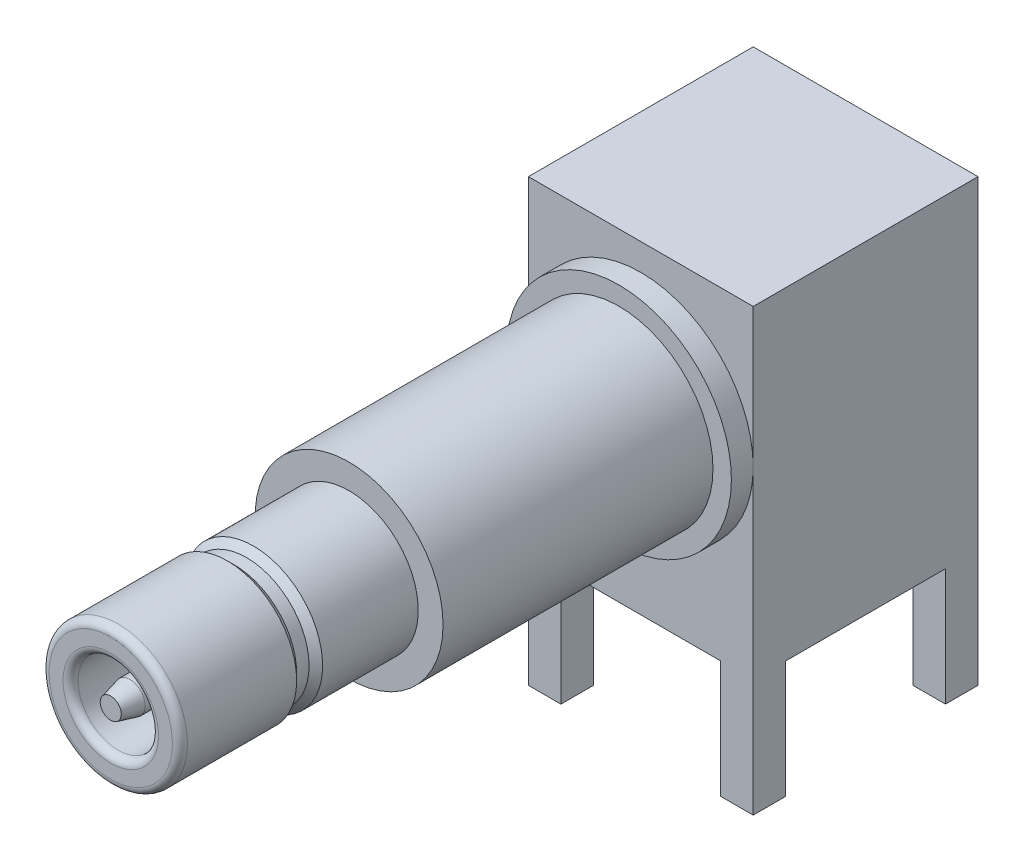
ISO-10303-21;
HEADER;
FILE_DESCRIPTION(('STEP AP214'),'2;1');
FILE_NAME('part.step','',(''),(''),'','','');
FILE_SCHEMA(('AUTOMOTIVE_DESIGN { 1 0 10303 214 1 1 1 1 }'));
ENDSEC;
DATA;
#1=APPLICATION_CONTEXT('core data for automotive mechanical design processes');
#2=APPLICATION_PROTOCOL_DEFINITION('international standard','automotive_design',2000,#1);
#3=PRODUCT_CONTEXT('',#1,'mechanical');
#4=PRODUCT('Part','Part','',(#3));
#5=PRODUCT_RELATED_PRODUCT_CATEGORY('part','',(#4));
#6=PRODUCT_DEFINITION_FORMATION('','',#4);
#7=PRODUCT_DEFINITION_CONTEXT('part definition',#1,'design');
#8=PRODUCT_DEFINITION('design','',#6,#7);
#9=PRODUCT_DEFINITION_SHAPE('','',#8);
#10=(LENGTH_UNIT() NAMED_UNIT(*) SI_UNIT(.MILLI.,.METRE.));
#11=(NAMED_UNIT(*) PLANE_ANGLE_UNIT() SI_UNIT($,.RADIAN.));
#12=(NAMED_UNIT(*) SI_UNIT($,.STERADIAN.) SOLID_ANGLE_UNIT());
#13=UNCERTAINTY_MEASURE_WITH_UNIT(LENGTH_MEASURE(1.E-05),#10,'distance_accuracy_value','');
#14=(GEOMETRIC_REPRESENTATION_CONTEXT(3) GLOBAL_UNCERTAINTY_ASSIGNED_CONTEXT((#13)) GLOBAL_UNIT_ASSIGNED_CONTEXT((#10,
#11,#12)) REPRESENTATION_CONTEXT('',''));
#15=CARTESIAN_POINT('',(0.,0.,0.));
#16=DIRECTION('',(0.,0.,1.));
#17=DIRECTION('',(1.,0.,0.));
#18=AXIS2_PLACEMENT_3D('',#15,#16,#17);
#19=CARTESIAN_POINT('',(0.,4.9,11.4319071733542));
#20=DIRECTION('',(0.,0.,1.));
#21=DIRECTION('',(1.,0.,0.));
#22=AXIS2_PLACEMENT_3D('',#19,#20,#21);
#23=PLANE('',#22);
#24=CARTESIAN_POINT('',(0.,4.9,11.4319071733542));
#25=DIRECTION('',(0.,0.,1.));
#26=DIRECTION('',(1.,0.,0.));
#27=AXIS2_PLACEMENT_3D('',#24,#25,#26);
#28=CIRCLE('',#27,1.07);
#29=CARTESIAN_POINT('',(1.07,4.9,11.4319071733542));
#30=VERTEX_POINT('',#29);
#31=EDGE_CURVE('E825',#30,#30,#28,.T.);
#32=ORIENTED_EDGE('',*,*,#31,.T.);
#33=EDGE_LOOP('',(#32));
#34=FACE_BOUND('',#33,.T.);
#35=CARTESIAN_POINT('',(0.,4.9,11.4319071733542));
#36=DIRECTION('',(0.,0.,1.));
#37=DIRECTION('',(1.,0.,0.));
#38=AXIS2_PLACEMENT_3D('',#35,#36,#37);
#39=CIRCLE('',#38,0.406972166883419);
#40=CARTESIAN_POINT('',(0.406972166883419,4.9,11.4319071733542));
#41=VERTEX_POINT('',#40);
#42=EDGE_CURVE('E839',#41,#41,#39,.T.);
#43=ORIENTED_EDGE('',*,*,#42,.F.);
#44=EDGE_LOOP('',(#43));
#45=FACE_BOUND('',#44,.T.);
#46=ADVANCED_FACE('F35',(#34,#45),#23,.T.);
#47=CARTESIAN_POINT('',(0.,4.9,17.09));
#48=DIRECTION('',(0.,0.,-1.));
#49=DIRECTION('',(-1.,0.,0.));
#50=AXIS2_PLACEMENT_3D('',#47,#48,#49);
#51=CYLINDRICAL_SURFACE('',#50,1.84);
#52=CARTESIAN_POINT('',(0.,4.9,13.295));
#53=DIRECTION('',(0.,0.,-1.));
#54=DIRECTION('',(-1.,0.,0.));
#55=AXIS2_PLACEMENT_3D('',#52,#53,#54);
#56=CIRCLE('',#55,1.84);
#57=CARTESIAN_POINT('',(-1.84,4.9,13.295));
#58=VERTEX_POINT('',#57);
#59=EDGE_CURVE('E808',#58,#58,#56,.T.);
#60=CARTESIAN_POINT('',(0.,4.9,10.75));
#61=DIRECTION('',(0.,0.,1.));
#62=DIRECTION('',(1.,0.,0.));
#63=AXIS2_PLACEMENT_3D('',#60,#61,#62);
#64=CIRCLE('',#63,1.84);
#65=CARTESIAN_POINT('',(-1.84,4.9,10.75));
#66=VERTEX_POINT('',#65);
#67=EDGE_CURVE('E810',#66,#66,#64,.T.);
#68=CARTESIAN_POINT('',(-1.84,4.9,13.295));
#69=CARTESIAN_POINT('',(-1.84,4.9,13.2684895833333));
#70=CARTESIAN_POINT('',(-1.84,4.9,13.2419791666667));
#71=CARTESIAN_POINT('',(-1.84,4.9,13.1889583333333));
#72=CARTESIAN_POINT('',(-1.84,4.9,13.1624479166667));
#73=CARTESIAN_POINT('',(-1.84,4.9,13.1094270833333));
#74=CARTESIAN_POINT('',(-1.84,4.9,13.0829166666667));
#75=CARTESIAN_POINT('',(-1.84,4.9,13.0298958333333));
#76=CARTESIAN_POINT('',(-1.84,4.9,13.0033854166667));
#77=CARTESIAN_POINT('',(-1.84,4.9,12.9503645833333));
#78=CARTESIAN_POINT('',(-1.84,4.9,12.9238541666667));
#79=CARTESIAN_POINT('',(-1.84,4.9,12.8708333333333));
#80=CARTESIAN_POINT('',(-1.84,4.9,12.8443229166667));
#81=CARTESIAN_POINT('',(-1.84,4.9,12.7913020833333));
#82=CARTESIAN_POINT('',(-1.84,4.9,12.7647916666667));
#83=CARTESIAN_POINT('',(-1.84,4.9,12.7117708333333));
#84=CARTESIAN_POINT('',(-1.84,4.9,12.6852604166667));
#85=CARTESIAN_POINT('',(-1.84,4.9,12.6322395833333));
#86=CARTESIAN_POINT('',(-1.84,4.9,12.6057291666667));
#87=CARTESIAN_POINT('',(-1.84,4.9,12.5527083333333));
#88=CARTESIAN_POINT('',(-1.84,4.9,12.5261979166667));
#89=CARTESIAN_POINT('',(-1.84,4.9,12.4731770833333));
#90=CARTESIAN_POINT('',(-1.84,4.9,12.4466666666667));
#91=CARTESIAN_POINT('',(-1.84,4.9,12.3936458333333));
#92=CARTESIAN_POINT('',(-1.84,4.9,12.3671354166667));
#93=CARTESIAN_POINT('',(-1.84,4.9,12.3141145833333));
#94=CARTESIAN_POINT('',(-1.84,4.9,12.2876041666667));
#95=CARTESIAN_POINT('',(-1.84,4.9,12.2345833333333));
#96=CARTESIAN_POINT('',(-1.84,4.9,12.2080729166667));
#97=CARTESIAN_POINT('',(-1.84,4.9,12.1550520833333));
#98=CARTESIAN_POINT('',(-1.84,4.9,12.1285416666667));
#99=CARTESIAN_POINT('',(-1.84,4.9,12.0755208333333));
#100=CARTESIAN_POINT('',(-1.84,4.9,12.0490104166667));
#101=CARTESIAN_POINT('',(-1.84,4.9,11.9959895833333));
#102=CARTESIAN_POINT('',(-1.84,4.9,11.9694791666667));
#103=CARTESIAN_POINT('',(-1.84,4.9,11.9164583333333));
#104=CARTESIAN_POINT('',(-1.84,4.9,11.8899479166667));
#105=CARTESIAN_POINT('',(-1.84,4.9,11.8369270833333));
#106=CARTESIAN_POINT('',(-1.84,4.9,11.8104166666667));
#107=CARTESIAN_POINT('',(-1.84,4.9,11.7573958333333));
#108=CARTESIAN_POINT('',(-1.84,4.9,11.7308854166667));
#109=CARTESIAN_POINT('',(-1.84,4.9,11.6778645833333));
#110=CARTESIAN_POINT('',(-1.84,4.9,11.6513541666667));
#111=CARTESIAN_POINT('',(-1.84,4.9,11.5983333333333));
#112=CARTESIAN_POINT('',(-1.84,4.9,11.5718229166667));
#113=CARTESIAN_POINT('',(-1.84,4.9,11.5188020833333));
#114=CARTESIAN_POINT('',(-1.84,4.9,11.4922916666667));
#115=CARTESIAN_POINT('',(-1.84,4.9,11.4392708333333));
#116=CARTESIAN_POINT('',(-1.84,4.9,11.4127604166667));
#117=CARTESIAN_POINT('',(-1.84,4.9,11.3597395833333));
#118=CARTESIAN_POINT('',(-1.84,4.9,11.3332291666667));
#119=CARTESIAN_POINT('',(-1.84,4.9,11.2802083333333));
#120=CARTESIAN_POINT('',(-1.84,4.9,11.2536979166667));
#121=CARTESIAN_POINT('',(-1.84,4.9,11.2006770833333));
#122=CARTESIAN_POINT('',(-1.84,4.9,11.1741666666667));
#123=CARTESIAN_POINT('',(-1.84,4.9,11.1211458333333));
#124=CARTESIAN_POINT('',(-1.84,4.9,11.0946354166667));
#125=CARTESIAN_POINT('',(-1.84,4.9,11.0416145833333));
#126=CARTESIAN_POINT('',(-1.84,4.9,11.0151041666667));
#127=CARTESIAN_POINT('',(-1.84,4.9,10.9620833333333));
#128=CARTESIAN_POINT('',(-1.84,4.9,10.9355729166667));
#129=CARTESIAN_POINT('',(-1.84,4.9,10.8825520833333));
#130=CARTESIAN_POINT('',(-1.84,4.9,10.8560416666667));
#131=CARTESIAN_POINT('',(-1.84,4.9,10.8030208333333));
#132=CARTESIAN_POINT('',(-1.84,4.9,10.7765104166667));
#133=CARTESIAN_POINT('',(-1.84,4.9,10.75));
#134=B_SPLINE_CURVE_WITH_KNOTS('',3,(#68,#69,#70,#71,#72,#73,#74,#75,#76,#77,#78,#79,#80,#81,
#82,#83,#84,#85,#86,#87,#88,#89,#90,#91,#92,#93,#94,#95,#96,#97,#98,#99,#100,#101,#102,#103,
#104,#105,#106,#107,#108,#109,#110,#111,#112,#113,#114,#115,#116,#117,#118,#119,#120,#121,#122,
#123,#124,#125,#126,#127,#128,#129,#130,#131,#132,#133),.UNSPECIFIED.,.F.,.F.,(4,2,2,2,2,2,2,2,
2,2,2,2,2,2,2,2,2,2,2,2,2,2,2,2,2,2,2,2,2,2,2,2,4),(0.,0.0795312500000006,0.159062499999999,
0.23859375,0.318125000000001,0.39765625,0.477187499999998,0.556718749999999,0.63625,0.71578125,
0.795312499999999,0.874843749999998,0.954374999999999,1.03390625,1.1134375,1.19296875,1.2725,
1.35203125,1.4315625,1.51109375,1.590625,1.67015625,1.7496875,1.82921875,1.90875,1.98828125,
2.0678125,2.14734375,2.226875,2.30640625,2.3859375,2.46546875,2.545),.UNSPECIFIED.);
#135=EDGE_CURVE('BSEAM384',#58,#66,#134,.T.);
#136=ORIENTED_EDGE('',*,*,#59,.T.);
#137=ORIENTED_EDGE('',*,*,#67,.T.);
#138=ORIENTED_EDGE('',*,*,#135,.T.);
#139=ORIENTED_EDGE('',*,*,#135,.F.);
#140=EDGE_LOOP('',(#136,#138,#137,#139));
#141=FACE_BOUND('',#140,.T.);
#142=ADVANCED_FACE('F384',(#141),#51,.T.);
#143=CARTESIAN_POINT('',(0.,4.9,10.75));
#144=DIRECTION('',(0.,0.,1.));
#145=DIRECTION('',(1.,0.,0.));
#146=AXIS2_PLACEMENT_3D('',#143,#144,#145);
#147=PLANE('',#146);
#148=CARTESIAN_POINT('',(0.,4.9,10.75));
#149=DIRECTION('',(0.,0.,1.));
#150=DIRECTION('',(1.,0.,0.));
#151=AXIS2_PLACEMENT_3D('',#148,#149,#150);
#152=CIRCLE('',#151,2.5);
#153=CARTESIAN_POINT('',(2.5,4.9,10.75));
#154=VERTEX_POINT('',#153);
#155=EDGE_CURVE('E181',#154,#154,#152,.T.);
#156=ORIENTED_EDGE('',*,*,#155,.T.);
#157=EDGE_LOOP('',(#156));
#158=FACE_BOUND('',#157,.T.);
#159=ORIENTED_EDGE('',*,*,#67,.F.);
#160=EDGE_LOOP('',(#159));
#161=FACE_BOUND('',#160,.T.);
#162=ADVANCED_FACE('F390',(#158,#161),#147,.T.);
#163=CARTESIAN_POINT('',(0.,4.9,3.57));
#164=DIRECTION('',(0.,0.,1.));
#165=DIRECTION('',(1.,0.,0.));
#166=AXIS2_PLACEMENT_3D('',#163,#164,#165);
#167=PLANE('',#166);
#168=CARTESIAN_POINT('',(0.,4.9,3.57));
#169=DIRECTION('',(0.,0.,1.));
#170=DIRECTION('',(1.,0.,0.));
#171=AXIS2_PLACEMENT_3D('',#168,#169,#170);
#172=CIRCLE('',#171,2.99);
#173=CARTESIAN_POINT('',(2.99,4.9,3.57));
#174=VERTEX_POINT('',#173);
#175=EDGE_CURVE('E180',#174,#174,#172,.T.);
#176=ORIENTED_EDGE('',*,*,#175,.T.);
#177=EDGE_LOOP('',(#176));
#178=FACE_BOUND('',#177,.T.);
#179=CARTESIAN_POINT('',(0.,4.9,3.57));
#180=DIRECTION('',(0.,0.,1.));
#181=DIRECTION('',(1.,0.,0.));
#182=AXIS2_PLACEMENT_3D('',#179,#180,#181);
#183=CIRCLE('',#182,2.5);
#184=CARTESIAN_POINT('',(2.5,4.9,3.57));
#185=VERTEX_POINT('',#184);
#186=EDGE_CURVE('E813',#185,#185,#183,.T.);
#187=ORIENTED_EDGE('',*,*,#186,.F.);
#188=EDGE_LOOP('',(#187));
#189=FACE_BOUND('',#188,.T.);
#190=ADVANCED_FACE('F425',(#178,#189),#167,.T.);
#191=CARTESIAN_POINT('',(-2.99,8.6,2.99));
#192=DIRECTION('',(0.,0.,-1.));
#193=DIRECTION('',(-1.,0.,0.));
#194=AXIS2_PLACEMENT_3D('',#191,#192,#193);
#195=PLANE('',#194);
#196=CARTESIAN_POINT('',(0.,4.9,2.99));
#197=DIRECTION('',(0.,0.,1.));
#198=DIRECTION('',(1.,0.,0.));
#199=AXIS2_PLACEMENT_3D('',#196,#197,#198);
#200=CIRCLE('',#199,2.99);
#201=CARTESIAN_POINT('',(2.99,4.9,2.99));
#202=VERTEX_POINT('',#201);
#203=CARTESIAN_POINT('',(-2.99,4.9,2.99));
#204=VERTEX_POINT('',#203);
#205=EDGE_CURVE('E175',#202,#204,#200,.T.);
#206=ORIENTED_EDGE('',*,*,#205,.F.);
#207=DIRECTION('',(0.,-1.,0.));
#208=VECTOR('',#207,1.);
#209=CARTESIAN_POINT('',(2.99,8.6,2.99));
#210=LINE('',#209,#208);
#211=CARTESIAN_POINT('',(2.99,8.6,2.99));
#212=VERTEX_POINT('',#211);
#213=EDGE_CURVE('E157',#212,#202,#210,.T.);
#214=ORIENTED_EDGE('',*,*,#213,.F.);
#215=DIRECTION('',(1.,0.,0.));
#216=VECTOR('',#215,1.);
#217=CARTESIAN_POINT('',(-2.99,8.6,2.99));
#218=LINE('',#217,#216);
#219=CARTESIAN_POINT('',(-2.99,8.6,2.99));
#220=VERTEX_POINT('',#219);
#221=EDGE_CURVE('E354',#220,#212,#218,.T.);
#222=ORIENTED_EDGE('',*,*,#221,.F.);
#223=DIRECTION('',(0.,-1.,0.));
#224=VECTOR('',#223,1.);
#225=CARTESIAN_POINT('',(-2.99,8.6,2.99));
#226=LINE('',#225,#224);
#227=EDGE_CURVE('E178',#220,#204,#226,.T.);
#228=ORIENTED_EDGE('',*,*,#227,.T.);
#229=EDGE_LOOP('',(#206,#214,#222,#228));
#230=FACE_BOUND('',#229,.T.);
#231=ADVANCED_FACE('F176',(#230),#195,.F.);
#232=EDGE_CURVE('E50',#204,#202,#200,.T.);
#233=ORIENTED_EDGE('',*,*,#232,.F.);
#234=CARTESIAN_POINT('',(-2.99,-3.12,2.99));
#235=VERTEX_POINT('',#234);
#236=EDGE_CURVE('E166',#204,#235,#226,.T.);
#237=ORIENTED_EDGE('',*,*,#236,.T.);
#238=DIRECTION('',(-1.,0.,0.));
#239=VECTOR('',#238,1.);
#240=CARTESIAN_POINT('',(-2.99,-3.12,2.99));
#241=LINE('',#240,#239);
#242=CARTESIAN_POINT('',(-2.125,-3.12,2.99));
#243=VERTEX_POINT('',#242);
#244=EDGE_CURVE('E266',#243,#235,#241,.T.);
#245=ORIENTED_EDGE('',*,*,#244,.F.);
#246=DIRECTION('',(0.,1.,0.));
#247=VECTOR('',#246,1.);
#248=CARTESIAN_POINT('',(-2.125,-3.12,2.99));
#249=LINE('',#248,#247);
#250=CARTESIAN_POINT('',(-2.125,0.,2.99));
#251=VERTEX_POINT('',#250);
#252=EDGE_CURVE('E276',#243,#251,#249,.T.);
#253=ORIENTED_EDGE('',*,*,#252,.T.);
#254=DIRECTION('',(1.,0.,0.));
#255=VECTOR('',#254,1.);
#256=CARTESIAN_POINT('',(-2.99,0.,2.99));
#257=LINE('',#256,#255);
#258=CARTESIAN_POINT('',(2.125,0.,2.99));
#259=VERTEX_POINT('',#258);
#260=EDGE_CURVE('E294',#251,#259,#257,.T.);
#261=ORIENTED_EDGE('',*,*,#260,.T.);
#262=DIRECTION('',(0.,1.,0.));
#263=VECTOR('',#262,1.);
#264=CARTESIAN_POINT('',(2.125,-3.12,2.99));
#265=LINE('',#264,#263);
#266=CARTESIAN_POINT('',(2.125,-3.12,2.99));
#267=VERTEX_POINT('',#266);
#268=EDGE_CURVE('E263',#267,#259,#265,.T.);
#269=ORIENTED_EDGE('',*,*,#268,.F.);
#270=DIRECTION('',(-1.,0.,0.));
#271=VECTOR('',#270,1.);
#272=CARTESIAN_POINT('',(2.99,-3.12,2.99));
#273=LINE('',#272,#271);
#274=CARTESIAN_POINT('',(2.99,-3.12,2.99));
#275=VERTEX_POINT('',#274);
#276=EDGE_CURVE('E170',#275,#267,#273,.T.);
#277=ORIENTED_EDGE('',*,*,#276,.F.);
#278=EDGE_CURVE('E160',#202,#275,#210,.T.);
#279=ORIENTED_EDGE('',*,*,#278,.F.);
#280=EDGE_LOOP('',(#233,#237,#245,#253,#261,#269,#277,#279));
#281=FACE_BOUND('',#280,.T.);
#282=ADVANCED_FACE('F168',(#281),#195,.F.);
#283=CARTESIAN_POINT('',(0.,0.254,0.));
#284=DIRECTION('',(0.,-1.,0.));
#285=DIRECTION('',(0.,0.,-1.));
#286=AXIS2_PLACEMENT_3D('',#283,#284,#285);
#287=PLANE('',#286);
#288=CARTESIAN_POINT('',(0.,0.254,0.));
#289=DIRECTION('',(0.,-1.,0.));
#290=DIRECTION('',(0.,0.,-1.));
#291=AXIS2_PLACEMENT_3D('',#288,#289,#290);
#292=CIRCLE('',#291,1.69360564063822);
#293=CARTESIAN_POINT('',(0.,0.254,-1.69360564063822));
#294=VERTEX_POINT('',#293);
#295=EDGE_CURVE('E199',#294,#294,#292,.T.);
#296=ORIENTED_EDGE('',*,*,#295,.T.);
#297=EDGE_LOOP('',(#296));
#298=FACE_BOUND('',#297,.T.);
#299=CARTESIAN_POINT('',(0.,0.254,0.));
#300=DIRECTION('',(0.,-1.,0.));
#301=DIRECTION('',(0.,0.,-1.));
#302=AXIS2_PLACEMENT_3D('',#299,#300,#301);
#303=CIRCLE('',#302,0.482600000000001);
#304=CARTESIAN_POINT('',(0.,0.254,-0.482600000000001));
#305=VERTEX_POINT('',#304);
#306=EDGE_CURVE('E192',#305,#305,#303,.T.);
#307=ORIENTED_EDGE('',*,*,#306,.F.);
#308=EDGE_LOOP('',(#307));
#309=FACE_BOUND('',#308,.T.);
#310=ADVANCED_FACE('F445',(#298,#309),#287,.T.);
#311=CARTESIAN_POINT('',(-2.99,0.,-2.99));
#312=DIRECTION('',(0.,-1.,0.));
#313=DIRECTION('',(0.,0.,-1.));
#314=AXIS2_PLACEMENT_3D('',#311,#312,#313);
#315=PLANE('',#314);
#316=CARTESIAN_POINT('',(0.,0.,0.));
#317=DIRECTION('',(0.,-1.,0.));
#318=DIRECTION('',(0.,0.,-1.));
#319=AXIS2_PLACEMENT_3D('',#316,#317,#318);
#320=CIRCLE('',#319,1.69360564063822);
#321=CARTESIAN_POINT('',(0.,0.,-1.69360564063822));
#322=VERTEX_POINT('',#321);
#323=EDGE_CURVE('E198',#322,#322,#320,.T.);
#324=ORIENTED_EDGE('',*,*,#323,.F.);
#325=EDGE_LOOP('',(#324));
#326=FACE_BOUND('',#325,.T.);
#327=DIRECTION('',(-1.,0.,0.));
#328=VECTOR('',#327,1.);
#329=CARTESIAN_POINT('',(-2.99,0.,-2.125));
#330=LINE('',#329,#328);
#331=CARTESIAN_POINT('',(-2.125,0.,-2.125));
#332=VERTEX_POINT('',#331);
#333=CARTESIAN_POINT('',(-2.99,0.,-2.125));
#334=VERTEX_POINT('',#333);
#335=EDGE_CURVE('E209',#332,#334,#330,.T.);
#336=ORIENTED_EDGE('',*,*,#335,.F.);
#337=DIRECTION('',(0.,0.,1.));
#338=VECTOR('',#337,1.);
#339=CARTESIAN_POINT('',(-2.125,0.,-2.99));
#340=LINE('',#339,#338);
#341=CARTESIAN_POINT('',(-2.125,0.,-2.99));
#342=VERTEX_POINT('',#341);
#343=EDGE_CURVE('E202',#342,#332,#340,.T.);
#344=ORIENTED_EDGE('',*,*,#343,.F.);
#345=DIRECTION('',(-1.,0.,0.));
#346=VECTOR('',#345,1.);
#347=CARTESIAN_POINT('',(-2.99,0.,-2.99));
#348=LINE('',#347,#346);
#349=CARTESIAN_POINT('',(2.125,0.,-2.99));
#350=VERTEX_POINT('',#349);
#351=EDGE_CURVE('E347',#350,#342,#348,.T.);
#352=ORIENTED_EDGE('',*,*,#351,.F.);
#353=DIRECTION('',(0.,0.,-1.));
#354=VECTOR('',#353,1.);
#355=CARTESIAN_POINT('',(2.125,0.,-2.99));
#356=LINE('',#355,#354);
#357=CARTESIAN_POINT('',(2.125,0.,-2.125));
#358=VERTEX_POINT('',#357);
#359=EDGE_CURVE('E231',#358,#350,#356,.T.);
#360=ORIENTED_EDGE('',*,*,#359,.F.);
#361=DIRECTION('',(-1.,0.,0.));
#362=VECTOR('',#361,1.);
#363=CARTESIAN_POINT('',(2.99,0.,-2.125));
#364=LINE('',#363,#362);
#365=CARTESIAN_POINT('',(2.99,0.,-2.125));
#366=VERTEX_POINT('',#365);
#367=EDGE_CURVE('E226',#366,#358,#364,.T.);
#368=ORIENTED_EDGE('',*,*,#367,.F.);
#369=DIRECTION('',(0.,0.,-1.));
#370=VECTOR('',#369,1.);
#371=CARTESIAN_POINT('',(2.99,0.,2.99));
#372=LINE('',#371,#370);
#373=CARTESIAN_POINT('',(2.99,0.,2.125));
#374=VERTEX_POINT('',#373);
#375=EDGE_CURVE('E305',#374,#366,#372,.T.);
#376=ORIENTED_EDGE('',*,*,#375,.F.);
#377=DIRECTION('',(1.,0.,0.));
#378=VECTOR('',#377,1.);
#379=CARTESIAN_POINT('',(2.99,0.,2.125));
#380=LINE('',#379,#378);
#381=CARTESIAN_POINT('',(2.125,0.,2.125));
#382=VERTEX_POINT('',#381);
#383=EDGE_CURVE('E249',#382,#374,#380,.T.);
#384=ORIENTED_EDGE('',*,*,#383,.F.);
#385=DIRECTION('',(0.,0.,-1.));
#386=VECTOR('',#385,1.);
#387=CARTESIAN_POINT('',(2.125,0.,2.99));
#388=LINE('',#387,#386);
#389=EDGE_CURVE('E246',#259,#382,#388,.T.);
#390=ORIENTED_EDGE('',*,*,#389,.F.);
#391=ORIENTED_EDGE('',*,*,#260,.F.);
#392=DIRECTION('',(0.,0.,1.));
#393=VECTOR('',#392,1.);
#394=CARTESIAN_POINT('',(-2.125,0.,2.99));
#395=LINE('',#394,#393);
#396=CARTESIAN_POINT('',(-2.125,0.,2.125));
#397=VERTEX_POINT('',#396);
#398=EDGE_CURVE('E270',#397,#251,#395,.T.);
#399=ORIENTED_EDGE('',*,*,#398,.F.);
#400=DIRECTION('',(1.,0.,0.));
#401=VECTOR('',#400,1.);
#402=CARTESIAN_POINT('',(-2.99,0.,2.125));
#403=LINE('',#402,#401);
#404=CARTESIAN_POINT('',(-2.99,0.,2.125));
#405=VERTEX_POINT('',#404);
#406=EDGE_CURVE('E265',#405,#397,#403,.T.);
#407=ORIENTED_EDGE('',*,*,#406,.F.);
#408=DIRECTION('',(0.,0.,1.));
#409=VECTOR('',#408,1.);
#410=CARTESIAN_POINT('',(-2.99,0.,2.99));
#411=LINE('',#410,#409);
#412=EDGE_CURVE('E291',#334,#405,#411,.T.);
#413=ORIENTED_EDGE('',*,*,#412,.F.);
#414=EDGE_LOOP('',(#336,#344,#352,#360,#368,#376,#384,#390,#391,#399,#407,#413));
#415=FACE_BOUND('',#414,.T.);
#416=ADVANCED_FACE('F328',(#326,#415),#315,.T.);
#417=CARTESIAN_POINT('',(-2.99,8.6,2.99));
#418=DIRECTION('',(1.,0.,0.));
#419=DIRECTION('',(0.,0.,-1.));
#420=AXIS2_PLACEMENT_3D('',#417,#418,#419);
#421=PLANE('',#420);
#422=DIRECTION('',(0.,-1.,0.));
#423=VECTOR('',#422,1.);
#424=CARTESIAN_POINT('',(-2.99,8.6,-2.99));
#425=LINE('',#424,#423);
#426=CARTESIAN_POINT('',(-2.99,8.6,-2.99));
#427=VERTEX_POINT('',#426);
#428=CARTESIAN_POINT('',(-2.99,-3.12,-2.99));
#429=VERTEX_POINT('',#428);
#430=EDGE_CURVE('E357',#427,#429,#425,.T.);
#431=ORIENTED_EDGE('',*,*,#430,.T.);
#432=DIRECTION('',(0.,0.,-1.));
#433=VECTOR('',#432,1.);
#434=CARTESIAN_POINT('',(-2.99,-3.12,-2.99));
#435=LINE('',#434,#433);
#436=CARTESIAN_POINT('',(-2.99,-3.12,-2.125));
#437=VERTEX_POINT('',#436);
#438=EDGE_CURVE('E213',#437,#429,#435,.T.);
#439=ORIENTED_EDGE('',*,*,#438,.F.);
#440=DIRECTION('',(0.,1.,0.));
#441=VECTOR('',#440,1.);
#442=CARTESIAN_POINT('',(-2.99,-3.12,-2.125));
#443=LINE('',#442,#441);
#444=EDGE_CURVE('E216',#437,#334,#443,.T.);
#445=ORIENTED_EDGE('',*,*,#444,.T.);
#446=ORIENTED_EDGE('',*,*,#412,.T.);
#447=DIRECTION('',(0.,1.,0.));
#448=VECTOR('',#447,1.);
#449=CARTESIAN_POINT('',(-2.99,-3.12,2.125));
#450=LINE('',#449,#448);
#451=CARTESIAN_POINT('',(-2.99,-3.12,2.125));
#452=VERTEX_POINT('',#451);
#453=EDGE_CURVE('E295',#452,#405,#450,.T.);
#454=ORIENTED_EDGE('',*,*,#453,.F.);
#455=DIRECTION('',(0.,0.,-1.));
#456=VECTOR('',#455,1.);
#457=CARTESIAN_POINT('',(-2.99,-3.12,2.99));
#458=LINE('',#457,#456);
#459=EDGE_CURVE('E269',#235,#452,#458,.T.);
#460=ORIENTED_EDGE('',*,*,#459,.F.);
#461=ORIENTED_EDGE('',*,*,#236,.F.);
#462=ORIENTED_EDGE('',*,*,#227,.F.);
#463=DIRECTION('',(0.,0.,1.));
#464=VECTOR('',#463,1.);
#465=CARTESIAN_POINT('',(-2.99,8.6,2.99));
#466=LINE('',#465,#464);
#467=EDGE_CURVE('E352',#427,#220,#466,.T.);
#468=ORIENTED_EDGE('',*,*,#467,.F.);
#469=EDGE_LOOP('',(#431,#439,#445,#446,#454,#460,#461,#462,#468));
#470=FACE_BOUND('',#469,.T.);
#471=ADVANCED_FACE('F337',(#470),#421,.F.);
#472=CARTESIAN_POINT('',(2.99,8.6,2.99));
#473=DIRECTION('',(-1.,0.,0.));
#474=DIRECTION('',(0.,0.,1.));
#475=AXIS2_PLACEMENT_3D('',#472,#473,#474);
#476=PLANE('',#475);
#477=ORIENTED_EDGE('',*,*,#213,.T.);
#478=ORIENTED_EDGE('',*,*,#278,.T.);
#479=DIRECTION('',(0.,0.,1.));
#480=VECTOR('',#479,1.);
#481=CARTESIAN_POINT('',(2.99,-3.12,2.99));
#482=LINE('',#481,#480);
#483=CARTESIAN_POINT('',(2.99,-3.12,2.125));
#484=VERTEX_POINT('',#483);
#485=EDGE_CURVE('E247',#484,#275,#482,.T.);
#486=ORIENTED_EDGE('',*,*,#485,.F.);
#487=DIRECTION('',(0.,1.,0.));
#488=VECTOR('',#487,1.);
#489=CARTESIAN_POINT('',(2.99,-3.12,2.125));
#490=LINE('',#489,#488);
#491=EDGE_CURVE('E255',#484,#374,#490,.T.);
#492=ORIENTED_EDGE('',*,*,#491,.T.);
#493=ORIENTED_EDGE('',*,*,#375,.T.);
#494=DIRECTION('',(0.,1.,0.));
#495=VECTOR('',#494,1.);
#496=CARTESIAN_POINT('',(2.99,-3.12,-2.125));
#497=LINE('',#496,#495);
#498=CARTESIAN_POINT('',(2.99,-3.12,-2.125));
#499=VERTEX_POINT('',#498);
#500=EDGE_CURVE('E244',#499,#366,#497,.T.);
#501=ORIENTED_EDGE('',*,*,#500,.F.);
#502=DIRECTION('',(0.,0.,1.));
#503=VECTOR('',#502,1.);
#504=CARTESIAN_POINT('',(2.99,-3.12,-2.99));
#505=LINE('',#504,#503);
#506=CARTESIAN_POINT('',(2.99,-3.12,-2.99));
#507=VERTEX_POINT('',#506);
#508=EDGE_CURVE('E227',#507,#499,#505,.T.);
#509=ORIENTED_EDGE('',*,*,#508,.F.);
#510=DIRECTION('',(0.,-1.,0.));
#511=VECTOR('',#510,1.);
#512=CARTESIAN_POINT('',(2.99,8.6,-2.99));
#513=LINE('',#512,#511);
#514=CARTESIAN_POINT('',(2.99,8.6,-2.99));
#515=VERTEX_POINT('',#514);
#516=EDGE_CURVE('E172',#515,#507,#513,.T.);
#517=ORIENTED_EDGE('',*,*,#516,.F.);
#518=DIRECTION('',(0.,0.,-1.));
#519=VECTOR('',#518,1.);
#520=CARTESIAN_POINT('',(2.99,8.6,2.99));
#521=LINE('',#520,#519);
#522=EDGE_CURVE('E163',#212,#515,#521,.T.);
#523=ORIENTED_EDGE('',*,*,#522,.F.);
#524=EDGE_LOOP('',(#477,#478,#486,#492,#493,#501,#509,#517,#523));
#525=FACE_BOUND('',#524,.T.);
#526=ADVANCED_FACE('F158',(#525),#476,.F.);
#527=CARTESIAN_POINT('',(-2.99,8.6,-2.99));
#528=DIRECTION('',(0.,0.,1.));
#529=DIRECTION('',(1.,0.,0.));
#530=AXIS2_PLACEMENT_3D('',#527,#528,#529);
#531=PLANE('',#530);
#532=ORIENTED_EDGE('',*,*,#516,.T.);
#533=DIRECTION('',(1.,0.,0.));
#534=VECTOR('',#533,1.);
#535=CARTESIAN_POINT('',(2.99,-3.12,-2.99));
#536=LINE('',#535,#534);
#537=CARTESIAN_POINT('',(2.125,-3.12,-2.99));
#538=VERTEX_POINT('',#537);
#539=EDGE_CURVE('E235',#538,#507,#536,.T.);
#540=ORIENTED_EDGE('',*,*,#539,.F.);
#541=DIRECTION('',(0.,1.,0.));
#542=VECTOR('',#541,1.);
#543=CARTESIAN_POINT('',(2.125,-3.12,-2.99));
#544=LINE('',#543,#542);
#545=EDGE_CURVE('E58',#538,#350,#544,.T.);
#546=ORIENTED_EDGE('',*,*,#545,.T.);
#547=ORIENTED_EDGE('',*,*,#351,.T.);
#548=DIRECTION('',(0.,1.,0.));
#549=VECTOR('',#548,1.);
#550=CARTESIAN_POINT('',(-2.125,-3.12,-2.99));
#551=LINE('',#550,#549);
#552=CARTESIAN_POINT('',(-2.125,-3.12,-2.99));
#553=VERTEX_POINT('',#552);
#554=EDGE_CURVE('E224',#553,#342,#551,.T.);
#555=ORIENTED_EDGE('',*,*,#554,.F.);
#556=DIRECTION('',(1.,0.,0.));
#557=VECTOR('',#556,1.);
#558=CARTESIAN_POINT('',(-2.99,-3.12,-2.99));
#559=LINE('',#558,#557);
#560=EDGE_CURVE('E205',#429,#553,#559,.T.);
#561=ORIENTED_EDGE('',*,*,#560,.F.);
#562=ORIENTED_EDGE('',*,*,#430,.F.);
#563=DIRECTION('',(-1.,0.,0.));
#564=VECTOR('',#563,1.);
#565=CARTESIAN_POINT('',(-2.99,8.6,-2.99));
#566=LINE('',#565,#564);
#567=EDGE_CURVE('E301',#515,#427,#566,.T.);
#568=ORIENTED_EDGE('',*,*,#567,.F.);
#569=EDGE_LOOP('',(#532,#540,#546,#547,#555,#561,#562,#568));
#570=FACE_BOUND('',#569,.T.);
#571=ADVANCED_FACE('F350',(#570),#531,.F.);
#572=CARTESIAN_POINT('',(-2.99,8.6,-2.99));
#573=DIRECTION('',(0.,-1.,0.));
#574=DIRECTION('',(0.,0.,-1.));
#575=AXIS2_PLACEMENT_3D('',#572,#573,#574);
#576=PLANE('',#575);
#577=ORIENTED_EDGE('',*,*,#467,.T.);
#578=ORIENTED_EDGE('',*,*,#221,.T.);
#579=ORIENTED_EDGE('',*,*,#522,.T.);
#580=ORIENTED_EDGE('',*,*,#567,.T.);
#581=EDGE_LOOP('',(#577,#578,#579,#580));
#582=FACE_BOUND('',#581,.T.);
#583=ADVANCED_FACE('F654',(#582),#576,.F.);
#584=CARTESIAN_POINT('',(-2.99,-3.12,2.125));
#585=DIRECTION('',(0.,0.,1.));
#586=DIRECTION('',(1.,0.,0.));
#587=AXIS2_PLACEMENT_3D('',#584,#585,#586);
#588=PLANE('',#587);
#589=ORIENTED_EDGE('',*,*,#406,.T.);
#590=DIRECTION('',(0.,1.,0.));
#591=VECTOR('',#590,1.);
#592=CARTESIAN_POINT('',(-2.125,-3.12,2.125));
#593=LINE('',#592,#591);
#594=CARTESIAN_POINT('',(-2.125,-3.12,2.125));
#595=VERTEX_POINT('',#594);
#596=EDGE_CURVE('E279',#595,#397,#593,.T.);
#597=ORIENTED_EDGE('',*,*,#596,.F.);
#598=DIRECTION('',(1.,0.,0.));
#599=VECTOR('',#598,1.);
#600=CARTESIAN_POINT('',(-2.99,-3.12,2.125));
#601=LINE('',#600,#599);
#602=EDGE_CURVE('E272',#452,#595,#601,.T.);
#603=ORIENTED_EDGE('',*,*,#602,.F.);
#604=ORIENTED_EDGE('',*,*,#453,.T.);
#605=EDGE_LOOP('',(#589,#597,#603,#604));
#606=FACE_BOUND('',#605,.T.);
#607=ADVANCED_FACE('F323',(#606),#588,.F.);
#608=CARTESIAN_POINT('',(-2.125,-3.12,2.99));
#609=DIRECTION('',(-1.,0.,0.));
#610=DIRECTION('',(0.,0.,1.));
#611=AXIS2_PLACEMENT_3D('',#608,#609,#610);
#612=PLANE('',#611);
#613=ORIENTED_EDGE('',*,*,#398,.T.);
#614=ORIENTED_EDGE('',*,*,#252,.F.);
#615=DIRECTION('',(0.,0.,1.));
#616=VECTOR('',#615,1.);
#617=CARTESIAN_POINT('',(-2.125,-3.12,2.99));
#618=LINE('',#617,#616);
#619=EDGE_CURVE('E274',#595,#243,#618,.T.);
#620=ORIENTED_EDGE('',*,*,#619,.F.);
#621=ORIENTED_EDGE('',*,*,#596,.T.);
#622=EDGE_LOOP('',(#613,#614,#620,#621));
#623=FACE_BOUND('',#622,.T.);
#624=ADVANCED_FACE('F321',(#623),#612,.F.);
#625=CARTESIAN_POINT('',(-2.99,-3.12,2.99));
#626=DIRECTION('',(0.,1.,0.));
#627=DIRECTION('',(0.,0.,1.));
#628=AXIS2_PLACEMENT_3D('',#625,#626,#627);
#629=PLANE('',#628);
#630=ORIENTED_EDGE('',*,*,#244,.T.);
#631=ORIENTED_EDGE('',*,*,#459,.T.);
#632=ORIENTED_EDGE('',*,*,#602,.T.);
#633=ORIENTED_EDGE('',*,*,#619,.T.);
#634=EDGE_LOOP('',(#630,#631,#632,#633));
#635=FACE_BOUND('',#634,.T.);
#636=ADVANCED_FACE('F335',(#635),#629,.F.);
#637=CARTESIAN_POINT('',(2.125,-3.12,2.99));
#638=DIRECTION('',(1.,0.,0.));
#639=DIRECTION('',(0.,0.,-1.));
#640=AXIS2_PLACEMENT_3D('',#637,#638,#639);
#641=PLANE('',#640);
#642=ORIENTED_EDGE('',*,*,#389,.T.);
#643=DIRECTION('',(0.,1.,0.));
#644=VECTOR('',#643,1.);
#645=CARTESIAN_POINT('',(2.125,-3.12,2.125));
#646=LINE('',#645,#644);
#647=CARTESIAN_POINT('',(2.125,-3.12,2.125));
#648=VERTEX_POINT('',#647);
#649=EDGE_CURVE('E261',#648,#382,#646,.T.);
#650=ORIENTED_EDGE('',*,*,#649,.F.);
#651=DIRECTION('',(0.,0.,-1.));
#652=VECTOR('',#651,1.);
#653=CARTESIAN_POINT('',(2.125,-3.12,2.99));
#654=LINE('',#653,#652);
#655=EDGE_CURVE('E251',#267,#648,#654,.T.);
#656=ORIENTED_EDGE('',*,*,#655,.F.);
#657=ORIENTED_EDGE('',*,*,#268,.T.);
#658=EDGE_LOOP('',(#642,#650,#656,#657));
#659=FACE_BOUND('',#658,.T.);
#660=ADVANCED_FACE('F680',(#659),#641,.F.);
#661=CARTESIAN_POINT('',(2.99,-3.12,2.125));
#662=DIRECTION('',(0.,0.,1.));
#663=DIRECTION('',(1.,0.,0.));
#664=AXIS2_PLACEMENT_3D('',#661,#662,#663);
#665=PLANE('',#664);
#666=ORIENTED_EDGE('',*,*,#383,.T.);
#667=ORIENTED_EDGE('',*,*,#491,.F.);
#668=DIRECTION('',(1.,0.,0.));
#669=VECTOR('',#668,1.);
#670=CARTESIAN_POINT('',(2.99,-3.12,2.125));
#671=LINE('',#670,#669);
#672=EDGE_CURVE('E253',#648,#484,#671,.T.);
#673=ORIENTED_EDGE('',*,*,#672,.F.);
#674=ORIENTED_EDGE('',*,*,#649,.T.);
#675=EDGE_LOOP('',(#666,#667,#673,#674));
#676=FACE_BOUND('',#675,.T.);
#677=ADVANCED_FACE('F687',(#676),#665,.F.);
#678=CARTESIAN_POINT('',(2.99,-3.12,2.125));
#679=DIRECTION('',(0.,1.,0.));
#680=DIRECTION('',(0.,0.,1.));
#681=AXIS2_PLACEMENT_3D('',#678,#679,#680);
#682=PLANE('',#681);
#683=ORIENTED_EDGE('',*,*,#485,.T.);
#684=ORIENTED_EDGE('',*,*,#276,.T.);
#685=ORIENTED_EDGE('',*,*,#655,.T.);
#686=ORIENTED_EDGE('',*,*,#672,.T.);
#687=EDGE_LOOP('',(#683,#684,#685,#686));
#688=FACE_BOUND('',#687,.T.);
#689=ADVANCED_FACE('F381',(#688),#682,.F.);
#690=CARTESIAN_POINT('',(2.99,-3.12,-2.125));
#691=DIRECTION('',(0.,0.,-1.));
#692=DIRECTION('',(-1.,0.,0.));
#693=AXIS2_PLACEMENT_3D('',#690,#691,#692);
#694=PLANE('',#693);
#695=ORIENTED_EDGE('',*,*,#367,.T.);
#696=DIRECTION('',(0.,1.,0.));
#697=VECTOR('',#696,1.);
#698=CARTESIAN_POINT('',(2.125,-3.12,-2.125));
#699=LINE('',#698,#697);
#700=CARTESIAN_POINT('',(2.125,-3.12,-2.125));
#701=VERTEX_POINT('',#700);
#702=EDGE_CURVE('E241',#701,#358,#699,.T.);
#703=ORIENTED_EDGE('',*,*,#702,.F.);
#704=DIRECTION('',(-1.,0.,0.));
#705=VECTOR('',#704,1.);
#706=CARTESIAN_POINT('',(2.99,-3.12,-2.125));
#707=LINE('',#706,#705);
#708=EDGE_CURVE('E230',#499,#701,#707,.T.);
#709=ORIENTED_EDGE('',*,*,#708,.F.);
#710=ORIENTED_EDGE('',*,*,#500,.T.);
#711=EDGE_LOOP('',(#695,#703,#709,#710));
#712=FACE_BOUND('',#711,.T.);
#713=ADVANCED_FACE('F369',(#712),#694,.F.);
#714=CARTESIAN_POINT('',(2.125,-3.12,-2.99));
#715=DIRECTION('',(1.,0.,0.));
#716=DIRECTION('',(0.,0.,-1.));
#717=AXIS2_PLACEMENT_3D('',#714,#715,#716);
#718=PLANE('',#717);
#719=ORIENTED_EDGE('',*,*,#359,.T.);
#720=ORIENTED_EDGE('',*,*,#545,.F.);
#721=DIRECTION('',(0.,0.,-1.));
#722=VECTOR('',#721,1.);
#723=CARTESIAN_POINT('',(2.125,-3.12,-2.99));
#724=LINE('',#723,#722);
#725=EDGE_CURVE('E233',#701,#538,#724,.T.);
#726=ORIENTED_EDGE('',*,*,#725,.F.);
#727=ORIENTED_EDGE('',*,*,#702,.T.);
#728=EDGE_LOOP('',(#719,#720,#726,#727));
#729=FACE_BOUND('',#728,.T.);
#730=ADVANCED_FACE('F372',(#729),#718,.F.);
#731=CARTESIAN_POINT('',(2.99,-3.12,-2.99));
#732=DIRECTION('',(0.,-1.,0.));
#733=DIRECTION('',(0.,0.,-1.));
#734=AXIS2_PLACEMENT_3D('',#731,#732,#733);
#735=PLANE('',#734);
#736=ORIENTED_EDGE('',*,*,#508,.T.);
#737=ORIENTED_EDGE('',*,*,#708,.T.);
#738=ORIENTED_EDGE('',*,*,#725,.T.);
#739=ORIENTED_EDGE('',*,*,#539,.T.);
#740=EDGE_LOOP('',(#736,#737,#738,#739));
#741=FACE_BOUND('',#740,.T.);
#742=ADVANCED_FACE('F363',(#741),#735,.T.);
#743=CARTESIAN_POINT('',(-2.125,-3.12,-2.99));
#744=DIRECTION('',(-1.,0.,0.));
#745=DIRECTION('',(0.,0.,1.));
#746=AXIS2_PLACEMENT_3D('',#743,#744,#745);
#747=PLANE('',#746);
#748=ORIENTED_EDGE('',*,*,#343,.T.);
#749=DIRECTION('',(0.,1.,0.));
#750=VECTOR('',#749,1.);
#751=CARTESIAN_POINT('',(-2.125,-3.12,-2.125));
#752=LINE('',#751,#750);
#753=CARTESIAN_POINT('',(-2.125,-3.12,-2.125));
#754=VERTEX_POINT('',#753);
#755=EDGE_CURVE('E221',#754,#332,#752,.T.);
#756=ORIENTED_EDGE('',*,*,#755,.F.);
#757=DIRECTION('',(0.,0.,1.));
#758=VECTOR('',#757,1.);
#759=CARTESIAN_POINT('',(-2.125,-3.12,-2.99));
#760=LINE('',#759,#758);
#761=EDGE_CURVE('E208',#553,#754,#760,.T.);
#762=ORIENTED_EDGE('',*,*,#761,.F.);
#763=ORIENTED_EDGE('',*,*,#554,.T.);
#764=EDGE_LOOP('',(#748,#756,#762,#763));
#765=FACE_BOUND('',#764,.T.);
#766=ADVANCED_FACE('F379',(#765),#747,.F.);
#767=CARTESIAN_POINT('',(-2.99,-3.12,-2.125));
#768=DIRECTION('',(0.,0.,-1.));
#769=DIRECTION('',(-1.,0.,0.));
#770=AXIS2_PLACEMENT_3D('',#767,#768,#769);
#771=PLANE('',#770);
#772=ORIENTED_EDGE('',*,*,#335,.T.);
#773=ORIENTED_EDGE('',*,*,#444,.F.);
#774=DIRECTION('',(-1.,0.,0.));
#775=VECTOR('',#774,1.);
#776=CARTESIAN_POINT('',(-2.99,-3.12,-2.125));
#777=LINE('',#776,#775);
#778=EDGE_CURVE('E211',#754,#437,#777,.T.);
#779=ORIENTED_EDGE('',*,*,#778,.F.);
#780=ORIENTED_EDGE('',*,*,#755,.T.);
#781=EDGE_LOOP('',(#772,#773,#779,#780));
#782=FACE_BOUND('',#781,.T.);
#783=ADVANCED_FACE('F342',(#782),#771,.F.);
#784=CARTESIAN_POINT('',(-2.99,-3.12,-2.99));
#785=DIRECTION('',(0.,-1.,0.));
#786=DIRECTION('',(0.,0.,-1.));
#787=AXIS2_PLACEMENT_3D('',#784,#785,#786);
#788=PLANE('',#787);
#789=ORIENTED_EDGE('',*,*,#560,.T.);
#790=ORIENTED_EDGE('',*,*,#761,.T.);
#791=ORIENTED_EDGE('',*,*,#778,.T.);
#792=ORIENTED_EDGE('',*,*,#438,.T.);
#793=EDGE_LOOP('',(#789,#790,#791,#792));
#794=FACE_BOUND('',#793,.T.);
#795=ADVANCED_FACE('F451',(#794),#788,.T.);
#796=CARTESIAN_POINT('',(0.,0.254,0.));
#797=DIRECTION('',(0.,-1.,0.));
#798=DIRECTION('',(0.,0.,-1.));
#799=AXIS2_PLACEMENT_3D('',#796,#797,#798);
#800=CYLINDRICAL_SURFACE('',#799,1.69360564063822);
#801=ORIENTED_EDGE('',*,*,#295,.F.);
#802=EDGE_LOOP('',(#801));
#803=FACE_BOUND('',#802,.T.);
#804=ORIENTED_EDGE('',*,*,#323,.T.);
#805=EDGE_LOOP('',(#804));
#806=FACE_BOUND('',#805,.T.);
#807=ADVANCED_FACE('F443',(#803,#806),#800,.F.);
#808=CARTESIAN_POINT('',(0.,-4.48499893040251,0.));
#809=DIRECTION('',(0.,1.,0.));
#810=DIRECTION('',(0.,0.,1.));
#811=AXIS2_PLACEMENT_3D('',#808,#809,#810);
#812=CYLINDRICAL_SURFACE('',#811,0.482600000000001);
#813=CARTESIAN_POINT('',(0.,-3.12,0.));
#814=DIRECTION('',(0.,1.,0.));
#815=DIRECTION('',(0.,0.,1.));
#816=AXIS2_PLACEMENT_3D('',#813,#814,#815);
#817=CIRCLE('',#816,0.482600000000001);
#818=CARTESIAN_POINT('',(0.,-3.12,0.482600000000001));
#819=VERTEX_POINT('',#818);
#820=EDGE_CURVE('E195',#819,#819,#817,.T.);
#821=ORIENTED_EDGE('',*,*,#820,.T.);
#822=EDGE_LOOP('',(#821));
#823=FACE_BOUND('',#822,.T.);
#824=ORIENTED_EDGE('',*,*,#306,.T.);
#825=EDGE_LOOP('',(#824));
#826=FACE_BOUND('',#825,.T.);
#827=ADVANCED_FACE('F439',(#823,#826),#812,.T.);
#828=CARTESIAN_POINT('',(2.99,-3.12,2.125));
#829=DIRECTION('',(0.,1.,0.));
#830=DIRECTION('',(0.,0.,1.));
#831=AXIS2_PLACEMENT_3D('',#828,#829,#830);
#832=PLANE('',#831);
#833=ORIENTED_EDGE('',*,*,#820,.F.);
#834=EDGE_LOOP('',(#833));
#835=FACE_BOUND('',#834,.T.);
#836=ADVANCED_FACE('F435',(#835),#832,.F.);
#837=CARTESIAN_POINT('',(0.,4.9,3.57));
#838=DIRECTION('',(0.,0.,-1.));
#839=DIRECTION('',(-1.,0.,0.));
#840=AXIS2_PLACEMENT_3D('',#837,#838,#839);
#841=CYLINDRICAL_SURFACE('',#840,2.99);
#842=ORIENTED_EDGE('',*,*,#175,.F.);
#843=EDGE_LOOP('',(#842));
#844=FACE_BOUND('',#843,.T.);
#845=ORIENTED_EDGE('',*,*,#205,.T.);
#846=ORIENTED_EDGE('',*,*,#232,.T.);
#847=EDGE_LOOP('',(#845,#846));
#848=FACE_BOUND('',#847,.T.);
#849=ADVANCED_FACE('F183',(#844,#848),#841,.T.);
#850=CARTESIAN_POINT('',(0.,4.9,10.75));
#851=DIRECTION('',(0.,0.,-1.));
#852=DIRECTION('',(-1.,0.,0.));
#853=AXIS2_PLACEMENT_3D('',#850,#851,#852);
#854=CYLINDRICAL_SURFACE('',#853,2.5);
#855=ORIENTED_EDGE('',*,*,#155,.F.);
#856=EDGE_LOOP('',(#855));
#857=FACE_BOUND('',#856,.T.);
#858=ORIENTED_EDGE('',*,*,#186,.T.);
#859=EDGE_LOOP('',(#858));
#860=FACE_BOUND('',#859,.T.);
#861=ADVANCED_FACE('F416',(#857,#860),#854,.T.);
#862=CARTESIAN_POINT('',(0.,4.9,12.7678932188134));
#863=DIRECTION('',(0.,0.,-1.));
#864=DIRECTION('',(-1.,0.,0.));
#865=AXIS2_PLACEMENT_3D('',#862,#863,#864);
#866=CONICAL_SURFACE('',#865,2.36710678118654,0.785398163397442);
#867=CARTESIAN_POINT('',(0.,4.9,13.475));
#868=DIRECTION('',(0.,0.,1.));
#869=DIRECTION('',(1.,0.,0.));
#870=AXIS2_PLACEMENT_3D('',#867,#868,#869);
#871=CIRCLE('',#870,1.66);
#872=CARTESIAN_POINT('',(1.66,4.9,13.475));
#873=VERTEX_POINT('',#872);
#874=EDGE_CURVE('E816',#873,#873,#871,.T.);
#875=ORIENTED_EDGE('',*,*,#874,.F.);
#876=EDGE_LOOP('',(#875));
#877=FACE_BOUND('',#876,.T.);
#878=ORIENTED_EDGE('',*,*,#59,.F.);
#879=EDGE_LOOP('',(#878));
#880=FACE_BOUND('',#879,.T.);
#881=ADVANCED_FACE('F408',(#877,#880),#866,.T.);
#882=CARTESIAN_POINT('',(0.,4.9,13.805));
#883=DIRECTION('',(0.,0.,1.));
#884=DIRECTION('',(1.,0.,0.));
#885=AXIS2_PLACEMENT_3D('',#882,#883,#884);
#886=CONICAL_SURFACE('',#885,1.66,0.78539816339745);
#887=CARTESIAN_POINT('',(0.,4.9,13.805));
#888=DIRECTION('',(0.,0.,1.));
#889=DIRECTION('',(1.,0.,0.));
#890=AXIS2_PLACEMENT_3D('',#887,#888,#889);
#891=CIRCLE('',#890,1.66);
#892=CARTESIAN_POINT('',(1.66,4.9,13.805));
#893=VERTEX_POINT('',#892);
#894=EDGE_CURVE('E820',#893,#893,#891,.T.);
#895=ORIENTED_EDGE('',*,*,#894,.T.);
#896=EDGE_LOOP('',(#895));
#897=FACE_BOUND('',#896,.T.);
#898=CARTESIAN_POINT('',(0.,4.9,13.985));
#899=DIRECTION('',(0.,0.,1.));
#900=DIRECTION('',(1.,0.,0.));
#901=AXIS2_PLACEMENT_3D('',#898,#899,#900);
#902=CIRCLE('',#901,1.84);
#903=CARTESIAN_POINT('',(-1.84,4.9,13.985));
#904=VERTEX_POINT('',#903);
#905=EDGE_CURVE('E296',#904,#904,#902,.T.);
#906=ORIENTED_EDGE('',*,*,#905,.F.);
#907=EDGE_LOOP('',(#906));
#908=FACE_BOUND('',#907,.T.);
#909=ADVANCED_FACE('F404',(#897,#908),#886,.T.);
#910=CARTESIAN_POINT('',(0.,4.9,17.09));
#911=DIRECTION('',(0.,0.,1.));
#912=DIRECTION('',(1.,0.,0.));
#913=AXIS2_PLACEMENT_3D('',#910,#911,#912);
#914=CYLINDRICAL_SURFACE('',#913,1.66);
#915=ORIENTED_EDGE('',*,*,#894,.F.);
#916=EDGE_LOOP('',(#915));
#917=FACE_BOUND('',#916,.T.);
#918=ORIENTED_EDGE('',*,*,#874,.T.);
#919=EDGE_LOOP('',(#918));
#920=FACE_BOUND('',#919,.T.);
#921=ADVANCED_FACE('F407',(#917,#920),#914,.T.);
#922=CARTESIAN_POINT('',(0.,4.9,17.09));
#923=DIRECTION('',(0.,0.,1.));
#924=DIRECTION('',(1.,0.,0.));
#925=AXIS2_PLACEMENT_3D('',#922,#923,#924);
#926=PLANE('',#925);
#927=CARTESIAN_POINT('',(0.,4.9,17.09));
#928=DIRECTION('',(0.,0.,1.));
#929=DIRECTION('',(1.,0.,0.));
#930=AXIS2_PLACEMENT_3D('',#927,#928,#929);
#931=CIRCLE('',#930,1.27);
#932=CARTESIAN_POINT('',(1.27,4.9,17.09));
#933=VERTEX_POINT('',#932);
#934=EDGE_CURVE('E43',#933,#933,#931,.F.);
#935=ORIENTED_EDGE('',*,*,#934,.T.);
#936=EDGE_LOOP('',(#935));
#937=FACE_BOUND('',#936,.T.);
#938=CARTESIAN_POINT('',(0.,4.9,17.09));
#939=DIRECTION('',(0.,0.,1.));
#940=DIRECTION('',(1.,0.,0.));
#941=AXIS2_PLACEMENT_3D('',#938,#939,#940);
#942=CIRCLE('',#941,1.64);
#943=CARTESIAN_POINT('',(1.64,4.9,17.09));
#944=VERTEX_POINT('',#943);
#945=EDGE_CURVE('E799',#944,#944,#942,.T.);
#946=ORIENTED_EDGE('',*,*,#945,.T.);
#947=EDGE_LOOP('',(#946));
#948=FACE_BOUND('',#947,.T.);
#949=ADVANCED_FACE('F412',(#937,#948),#926,.T.);
#950=CARTESIAN_POINT('',(0.,4.9,16.89));
#951=DIRECTION('',(0.,0.,1.));
#952=DIRECTION('',(1.,0.,0.));
#953=AXIS2_PLACEMENT_3D('',#950,#951,#952);
#954=CIRCLE('',#953,1.84);
#955=CARTESIAN_POINT('',(-1.84,4.9,16.89));
#956=VERTEX_POINT('',#955);
#957=EDGE_CURVE('E11',#956,#956,#954,.F.);
#958=CARTESIAN_POINT('',(-1.84,4.9,16.89));
#959=CARTESIAN_POINT('',(-1.84,4.9,16.8597395833333));
#960=CARTESIAN_POINT('',(-1.84,4.9,16.8294791666667));
#961=CARTESIAN_POINT('',(-1.84,4.9,16.7689583333333));
#962=CARTESIAN_POINT('',(-1.84,4.9,16.7386979166667));
#963=CARTESIAN_POINT('',(-1.84,4.9,16.6781770833333));
#964=CARTESIAN_POINT('',(-1.84,4.9,16.6479166666667));
#965=CARTESIAN_POINT('',(-1.84,4.9,16.5873958333333));
#966=CARTESIAN_POINT('',(-1.84,4.9,16.5571354166667));
#967=CARTESIAN_POINT('',(-1.84,4.9,16.4966145833333));
#968=CARTESIAN_POINT('',(-1.84,4.9,16.4663541666667));
#969=CARTESIAN_POINT('',(-1.84,4.9,16.4058333333333));
#970=CARTESIAN_POINT('',(-1.84,4.9,16.3755729166667));
#971=CARTESIAN_POINT('',(-1.84,4.9,16.3150520833333));
#972=CARTESIAN_POINT('',(-1.84,4.9,16.2847916666667));
#973=CARTESIAN_POINT('',(-1.84,4.9,16.2242708333333));
#974=CARTESIAN_POINT('',(-1.84,4.9,16.1940104166667));
#975=CARTESIAN_POINT('',(-1.84,4.9,16.1334895833333));
#976=CARTESIAN_POINT('',(-1.84,4.9,16.1032291666667));
#977=CARTESIAN_POINT('',(-1.84,4.9,16.0427083333333));
#978=CARTESIAN_POINT('',(-1.84,4.9,16.0124479166667));
#979=CARTESIAN_POINT('',(-1.84,4.9,15.9519270833333));
#980=CARTESIAN_POINT('',(-1.84,4.9,15.9216666666667));
#981=CARTESIAN_POINT('',(-1.84,4.9,15.8611458333333));
#982=CARTESIAN_POINT('',(-1.84,4.9,15.8308854166667));
#983=CARTESIAN_POINT('',(-1.84,4.9,15.7703645833333));
#984=CARTESIAN_POINT('',(-1.84,4.9,15.7401041666667));
#985=CARTESIAN_POINT('',(-1.84,4.9,15.6795833333333));
#986=CARTESIAN_POINT('',(-1.84,4.9,15.6493229166667));
#987=CARTESIAN_POINT('',(-1.84,4.9,15.5888020833333));
#988=CARTESIAN_POINT('',(-1.84,4.9,15.5585416666667));
#989=CARTESIAN_POINT('',(-1.84,4.9,15.4980208333333));
#990=CARTESIAN_POINT('',(-1.84,4.9,15.4677604166667));
#991=CARTESIAN_POINT('',(-1.84,4.9,15.4072395833333));
#992=CARTESIAN_POINT('',(-1.84,4.9,15.3769791666667));
#993=CARTESIAN_POINT('',(-1.84,4.9,15.3164583333333));
#994=CARTESIAN_POINT('',(-1.84,4.9,15.2861979166667));
#995=CARTESIAN_POINT('',(-1.84,4.9,15.2256770833333));
#996=CARTESIAN_POINT('',(-1.84,4.9,15.1954166666667));
#997=CARTESIAN_POINT('',(-1.84,4.9,15.1348958333333));
#998=CARTESIAN_POINT('',(-1.84,4.9,15.1046354166667));
#999=CARTESIAN_POINT('',(-1.84,4.9,15.0441145833333));
#1000=CARTESIAN_POINT('',(-1.84,4.9,15.0138541666667));
#1001=CARTESIAN_POINT('',(-1.84,4.9,14.9533333333333));
#1002=CARTESIAN_POINT('',(-1.84,4.9,14.9230729166667));
#1003=CARTESIAN_POINT('',(-1.84,4.9,14.8625520833333));
#1004=CARTESIAN_POINT('',(-1.84,4.9,14.8322916666667));
#1005=CARTESIAN_POINT('',(-1.84,4.9,14.7717708333333));
#1006=CARTESIAN_POINT('',(-1.84,4.9,14.7415104166667));
#1007=CARTESIAN_POINT('',(-1.84,4.9,14.6809895833333));
#1008=CARTESIAN_POINT('',(-1.84,4.9,14.6507291666667));
#1009=CARTESIAN_POINT('',(-1.84,4.9,14.5902083333333));
#1010=CARTESIAN_POINT('',(-1.84,4.9,14.5599479166667));
#1011=CARTESIAN_POINT('',(-1.84,4.9,14.4994270833333));
#1012=CARTESIAN_POINT('',(-1.84,4.9,14.4691666666667));
#1013=CARTESIAN_POINT('',(-1.84,4.9,14.4086458333333));
#1014=CARTESIAN_POINT('',(-1.84,4.9,14.3783854166667));
#1015=CARTESIAN_POINT('',(-1.84,4.9,14.3178645833333));
#1016=CARTESIAN_POINT('',(-1.84,4.9,14.2876041666667));
#1017=CARTESIAN_POINT('',(-1.84,4.9,14.2270833333333));
#1018=CARTESIAN_POINT('',(-1.84,4.9,14.1968229166667));
#1019=CARTESIAN_POINT('',(-1.84,4.9,14.1363020833333));
#1020=CARTESIAN_POINT('',(-1.84,4.9,14.1060416666667));
#1021=CARTESIAN_POINT('',(-1.84,4.9,14.0455208333333));
#1022=CARTESIAN_POINT('',(-1.84,4.9,14.0152604166667));
#1023=CARTESIAN_POINT('',(-1.84,4.9,13.985));
#1024=B_SPLINE_CURVE_WITH_KNOTS('',3,(#958,#959,#960,#961,#962,#963,#964,#965,#966,#967,#968,
#969,#970,#971,#972,#973,#974,#975,#976,#977,#978,#979,#980,#981,#982,#983,#984,#985,#986,#987,
#988,#989,#990,#991,#992,#993,#994,#995,#996,#997,#998,#999,#1000,#1001,#1002,#1003,#1004,#1005,
#1006,#1007,#1008,#1009,#1010,#1011,#1012,#1013,#1014,#1015,#1016,#1017,#1018,#1019,#1020,#1021,
#1022,#1023),.UNSPECIFIED.,.F.,.F.,(4,2,2,2,2,2,2,2,2,2,2,2,2,2,2,2,2,2,2,2,2,2,2,2,2,2,2,2,2,2,
2,2,4),(0.,0.0907812500000015,0.181562500000003,0.272343750000001,0.363125000000002,0.45390625,
0.544687500000002,0.635468750000003,0.726250000000001,0.817031250000003,0.907812500000001,
0.998593750000002,1.089375,1.18015625,1.2709375,1.36171875,1.4525,1.54328125,1.6340625,
1.72484375,1.815625,1.90640625,1.9971875,2.08796875,2.17875,2.26953125,2.3603125,2.45109375,
2.541875,2.63265625,2.7234375,2.81421875,2.905),.UNSPECIFIED.);
#1025=EDGE_CURVE('BSEAM393',#956,#904,#1024,.T.);
#1026=ORIENTED_EDGE('',*,*,#957,.T.);
#1027=ORIENTED_EDGE('',*,*,#905,.T.);
#1028=ORIENTED_EDGE('',*,*,#1025,.T.);
#1029=ORIENTED_EDGE('',*,*,#1025,.F.);
#1030=EDGE_LOOP('',(#1026,#1028,#1027,#1029));
#1031=FACE_BOUND('',#1030,.T.);
#1032=ADVANCED_FACE('F393',(#1031),#51,.T.);
#1033=CARTESIAN_POINT('',(0.,4.9,11.4319071733542));
#1034=DIRECTION('',(0.,0.,1.));
#1035=DIRECTION('',(1.,0.,0.));
#1036=AXIS2_PLACEMENT_3D('',#1033,#1034,#1035);
#1037=CYLINDRICAL_SURFACE('',#1036,1.07);
#1038=CARTESIAN_POINT('',(0.,4.9,16.89));
#1039=DIRECTION('',(0.,0.,1.));
#1040=DIRECTION('',(1.,0.,0.));
#1041=AXIS2_PLACEMENT_3D('',#1038,#1039,#1040);
#1042=CIRCLE('',#1041,1.07);
#1043=CARTESIAN_POINT('',(1.07,4.9,16.89));
#1044=VERTEX_POINT('',#1043);
#1045=EDGE_CURVE('E801',#1044,#1044,#1042,.T.);
#1046=ORIENTED_EDGE('',*,*,#1045,.T.);
#1047=EDGE_LOOP('',(#1046));
#1048=FACE_BOUND('',#1047,.T.);
#1049=ORIENTED_EDGE('',*,*,#31,.F.);
#1050=EDGE_LOOP('',(#1049));
#1051=FACE_BOUND('',#1050,.T.);
#1052=ADVANCED_FACE('F400',(#1048,#1051),#1037,.F.);
#1053=CARTESIAN_POINT('',(0.,4.9,17.09));
#1054=DIRECTION('',(0.,0.,-1.));
#1055=DIRECTION('',(-1.,0.,0.));
#1056=AXIS2_PLACEMENT_3D('',#1053,#1054,#1055);
#1057=CYLINDRICAL_SURFACE('',#1056,0.406972166883419);
#1058=CARTESIAN_POINT('',(0.,4.9,16.582));
#1059=DIRECTION('',(0.,0.,1.));
#1060=DIRECTION('',(1.,0.,0.));
#1061=AXIS2_PLACEMENT_3D('',#1058,#1059,#1060);
#1062=CIRCLE('',#1061,0.406972166883419);
#1063=CARTESIAN_POINT('',(0.406972166883419,4.9,16.582));
#1064=VERTEX_POINT('',#1063);
#1065=EDGE_CURVE('E186',#1064,#1064,#1062,.F.);
#1066=ORIENTED_EDGE('',*,*,#1065,.T.);
#1067=EDGE_LOOP('',(#1066));
#1068=FACE_BOUND('',#1067,.T.);
#1069=ORIENTED_EDGE('',*,*,#42,.T.);
#1070=EDGE_LOOP('',(#1069));
#1071=FACE_BOUND('',#1070,.T.);
#1072=ADVANCED_FACE('F398',(#1068,#1071),#1057,.T.);
#1073=CARTESIAN_POINT('',(0.,4.9,17.09));
#1074=DIRECTION('',(0.,0.,1.));
#1075=DIRECTION('',(1.,0.,0.));
#1076=AXIS2_PLACEMENT_3D('',#1073,#1074,#1075);
#1077=PLANE('',#1076);
#1078=CARTESIAN_POINT('',(0.,4.9,17.09));
#1079=DIRECTION('',(0.,0.,1.));
#1080=DIRECTION('',(1.,0.,0.));
#1081=AXIS2_PLACEMENT_3D('',#1078,#1079,#1080);
#1082=CIRCLE('',#1081,0.280313541439075);
#1083=CARTESIAN_POINT('',(0.280313541439075,4.9,17.09));
#1084=VERTEX_POINT('',#1083);
#1085=EDGE_CURVE('E184',#1084,#1084,#1082,.T.);
#1086=ORIENTED_EDGE('',*,*,#1085,.T.);
#1087=EDGE_LOOP('',(#1086));
#1088=FACE_BOUND('',#1087,.T.);
#1089=ADVANCED_FACE('F531',(#1088),#1077,.T.);
#1090=CARTESIAN_POINT('',(0.,4.9,17.09));
#1091=DIRECTION('',(0.,0.,-1.));
#1092=DIRECTION('',(-1.,0.,0.));
#1093=AXIS2_PLACEMENT_3D('',#1090,#1091,#1092);
#1094=CONICAL_SURFACE('',#1093,0.280313541439075,0.244346095279205);
#1095=ORIENTED_EDGE('',*,*,#1065,.F.);
#1096=EDGE_LOOP('',(#1095));
#1097=FACE_BOUND('',#1096,.T.);
#1098=ORIENTED_EDGE('',*,*,#1085,.F.);
#1099=EDGE_LOOP('',(#1098));
#1100=FACE_BOUND('',#1099,.T.);
#1101=ADVANCED_FACE('F538',(#1097,#1100),#1094,.T.);
#1102=CARTESIAN_POINT('',(0.,4.9,16.89));
#1103=DIRECTION('',(0.,0.,1.));
#1104=DIRECTION('',(1.,0.,0.));
#1105=AXIS2_PLACEMENT_3D('',#1102,#1103,#1104);
#1106=TOROIDAL_SURFACE('',#1105,1.27,0.2);
#1107=ORIENTED_EDGE('',*,*,#934,.F.);
#1108=EDGE_LOOP('',(#1107));
#1109=FACE_BOUND('',#1108,.T.);
#1110=ORIENTED_EDGE('',*,*,#1045,.F.);
#1111=EDGE_LOOP('',(#1110));
#1112=FACE_BOUND('',#1111,.T.);
#1113=ADVANCED_FACE('F545',(#1109,#1112),#1106,.T.);
#1114=CARTESIAN_POINT('',(0.,4.9,16.89));
#1115=DIRECTION('',(0.,0.,1.));
#1116=DIRECTION('',(1.,0.,0.));
#1117=AXIS2_PLACEMENT_3D('',#1114,#1115,#1116);
#1118=TOROIDAL_SURFACE('',#1117,1.64,0.2);
#1119=ORIENTED_EDGE('',*,*,#957,.F.);
#1120=EDGE_LOOP('',(#1119));
#1121=FACE_BOUND('',#1120,.T.);
#1122=ORIENTED_EDGE('',*,*,#945,.F.);
#1123=EDGE_LOOP('',(#1122));
#1124=FACE_BOUND('',#1123,.T.);
#1125=ADVANCED_FACE('F37',(#1121,#1124),#1118,.T.);
#1126=CLOSED_SHELL('',(#46,#142,#162,#190,#231,#282,#310,#416,#471,#526,#571,#583,#607,#624,
#636,#660,#677,#689,#713,#730,#742,#766,#783,#795,#807,#827,#836,#849,#861,#881,#909,#921,#949,
#1032,#1052,#1072,#1089,#1101,#1113,#1125));
#1127=MANIFOLD_SOLID_BREP('B2',#1126);
#1128=ADVANCED_BREP_SHAPE_REPRESENTATION('',(#18,#1127),#14);
#1129=SHAPE_DEFINITION_REPRESENTATION(#9,#1128);
ENDSEC;
END-ISO-10303-21;
